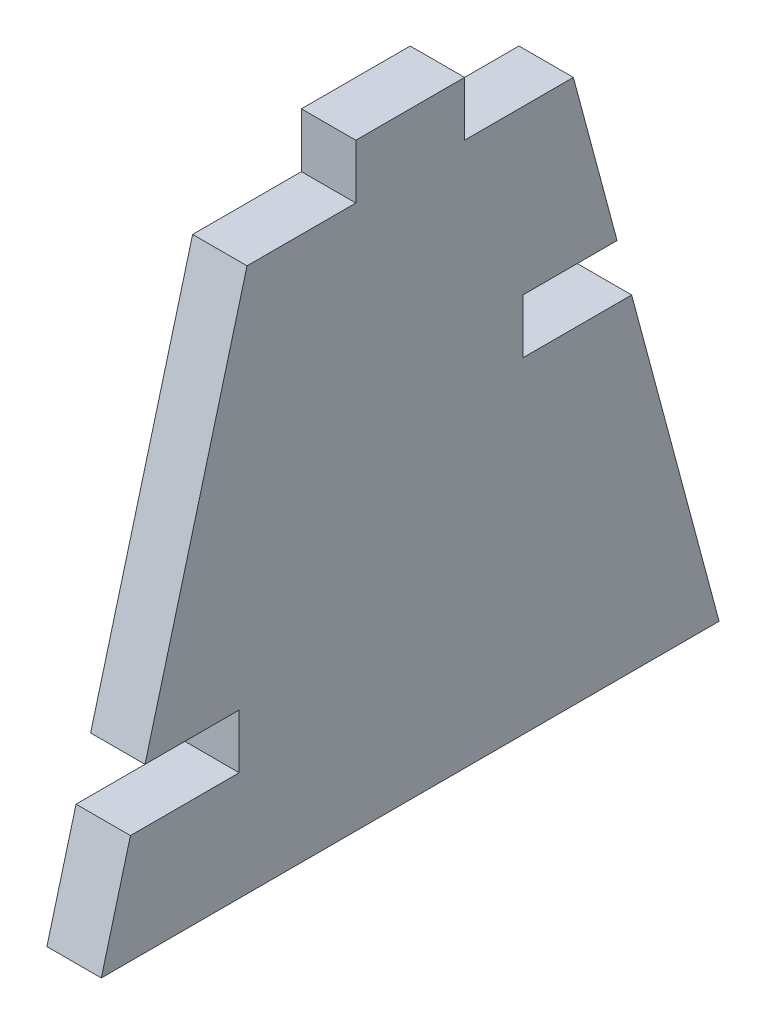
ISO-10303-21;
HEADER;
FILE_DESCRIPTION(('STEP AP214'),'2;1');
FILE_NAME('part.step','',(''),(''),'','','');
FILE_SCHEMA(('AUTOMOTIVE_DESIGN { 1 0 10303 214 1 1 1 1 }'));
ENDSEC;
DATA;
#1=APPLICATION_CONTEXT('core data for automotive mechanical design processes');
#2=APPLICATION_PROTOCOL_DEFINITION('international standard','automotive_design',2000,#1);
#3=PRODUCT_CONTEXT('',#1,'mechanical');
#4=PRODUCT('Part','Part','',(#3));
#5=PRODUCT_RELATED_PRODUCT_CATEGORY('part','',(#4));
#6=PRODUCT_DEFINITION_FORMATION('','',#4);
#7=PRODUCT_DEFINITION_CONTEXT('part definition',#1,'design');
#8=PRODUCT_DEFINITION('design','',#6,#7);
#9=PRODUCT_DEFINITION_SHAPE('','',#8);
#10=(LENGTH_UNIT() NAMED_UNIT(*) SI_UNIT(.MILLI.,.METRE.));
#11=(NAMED_UNIT(*) PLANE_ANGLE_UNIT() SI_UNIT($,.RADIAN.));
#12=(NAMED_UNIT(*) SI_UNIT($,.STERADIAN.) SOLID_ANGLE_UNIT());
#13=UNCERTAINTY_MEASURE_WITH_UNIT(LENGTH_MEASURE(1.E-05),#10,'distance_accuracy_value','');
#14=(GEOMETRIC_REPRESENTATION_CONTEXT(3) GLOBAL_UNCERTAINTY_ASSIGNED_CONTEXT((#13)) GLOBAL_UNIT_ASSIGNED_CONTEXT((#10,
#11,#12)) REPRESENTATION_CONTEXT('',''));
#15=CARTESIAN_POINT('',(0.,0.,0.));
#16=DIRECTION('',(0.,0.,1.));
#17=DIRECTION('',(1.,0.,0.));
#18=AXIS2_PLACEMENT_3D('',#15,#16,#17);
#19=CARTESIAN_POINT('',(-10.,100.,-26.7949192431127));
#20=DIRECTION('',(0.,-1.,0.));
#21=DIRECTION('',(0.,0.,-1.));
#22=AXIS2_PLACEMENT_3D('',#19,#20,#21);
#23=PLANE('',#22);
#24=DIRECTION('',(0.,0.,-1.));
#25=VECTOR('',#24,1.);
#26=CARTESIAN_POINT('',(0.,100.,-26.7949192431127));
#27=LINE('',#26,#25);
#28=CARTESIAN_POINT('',(0.,100.,-26.7949192431127));
#29=VERTEX_POINT('',#28);
#30=CARTESIAN_POINT('',(0.,100.,-46.7949192431127));
#31=VERTEX_POINT('',#30);
#32=EDGE_CURVE('E177',#29,#31,#27,.T.);
#33=ORIENTED_EDGE('',*,*,#32,.T.);
#34=DIRECTION('',(1.,0.,0.));
#35=VECTOR('',#34,1.);
#36=CARTESIAN_POINT('',(-10.,100.,-46.7949192431127));
#37=LINE('',#36,#35);
#38=CARTESIAN_POINT('',(-10.,100.,-46.7949192431127));
#39=VERTEX_POINT('',#38);
#40=EDGE_CURVE('E11',#39,#31,#37,.T.);
#41=ORIENTED_EDGE('',*,*,#40,.F.);
#42=DIRECTION('',(0.,0.,-1.));
#43=VECTOR('',#42,1.);
#44=CARTESIAN_POINT('',(-10.,100.,-26.7949192431127));
#45=LINE('',#44,#43);
#46=CARTESIAN_POINT('',(-10.,100.,-26.7949192431127));
#47=VERTEX_POINT('',#46);
#48=EDGE_CURVE('E111',#47,#39,#45,.T.);
#49=ORIENTED_EDGE('',*,*,#48,.F.);
#50=DIRECTION('',(1.,0.,0.));
#51=VECTOR('',#50,1.);
#52=CARTESIAN_POINT('',(-10.,100.,-26.7949192431127));
#53=LINE('',#52,#51);
#54=EDGE_CURVE('E49',#47,#29,#53,.T.);
#55=ORIENTED_EDGE('',*,*,#54,.T.);
#56=EDGE_LOOP('',(#33,#41,#49,#55));
#57=FACE_BOUND('',#56,.T.);
#58=ADVANCED_FACE('F33',(#57),#23,.F.);
#59=CARTESIAN_POINT('',(-10.,110.,-46.7949192431127));
#60=DIRECTION('',(0.,0.,1.));
#61=DIRECTION('',(1.,0.,0.));
#62=AXIS2_PLACEMENT_3D('',#59,#60,#61);
#63=PLANE('',#62);
#64=DIRECTION('',(0.,-1.,0.));
#65=VECTOR('',#64,1.);
#66=CARTESIAN_POINT('',(0.,110.,-46.7949192431127));
#67=LINE('',#66,#65);
#68=CARTESIAN_POINT('',(0.,110.,-46.7949192431127));
#69=VERTEX_POINT('',#68);
#70=EDGE_CURVE('E179',#69,#31,#67,.T.);
#71=ORIENTED_EDGE('',*,*,#70,.F.);
#72=DIRECTION('',(1.,0.,0.));
#73=VECTOR('',#72,1.);
#74=CARTESIAN_POINT('',(-10.,110.,-46.7949192431127));
#75=LINE('',#74,#73);
#76=CARTESIAN_POINT('',(-10.,110.,-46.7949192431127));
#77=VERTEX_POINT('',#76);
#78=EDGE_CURVE('E41',#77,#69,#75,.T.);
#79=ORIENTED_EDGE('',*,*,#78,.F.);
#80=DIRECTION('',(0.,-1.,0.));
#81=VECTOR('',#80,1.);
#82=CARTESIAN_POINT('',(-10.,110.,-46.7949192431127));
#83=LINE('',#82,#81);
#84=EDGE_CURVE('E463',#77,#39,#83,.T.);
#85=ORIENTED_EDGE('',*,*,#84,.T.);
#86=ORIENTED_EDGE('',*,*,#40,.T.);
#87=EDGE_LOOP('',(#71,#79,#85,#86));
#88=FACE_BOUND('',#87,.T.);
#89=ADVANCED_FACE('F251',(#88),#63,.T.);
#90=CARTESIAN_POINT('',(-10.,110.,-66.7949192431127));
#91=DIRECTION('',(0.,1.,0.));
#92=DIRECTION('',(0.,0.,1.));
#93=AXIS2_PLACEMENT_3D('',#90,#91,#92);
#94=PLANE('',#93);
#95=DIRECTION('',(0.,0.,1.));
#96=VECTOR('',#95,1.);
#97=CARTESIAN_POINT('',(0.,110.,-66.7949192431127));
#98=LINE('',#97,#96);
#99=CARTESIAN_POINT('',(0.,110.,-66.7949192431127));
#100=VERTEX_POINT('',#99);
#101=EDGE_CURVE('E182',#100,#69,#98,.T.);
#102=ORIENTED_EDGE('',*,*,#101,.F.);
#103=DIRECTION('',(1.,0.,0.));
#104=VECTOR('',#103,1.);
#105=CARTESIAN_POINT('',(-10.,110.,-66.7949192431127));
#106=LINE('',#105,#104);
#107=CARTESIAN_POINT('',(-10.,110.,-66.7949192431127));
#108=VERTEX_POINT('',#107);
#109=EDGE_CURVE('E241',#108,#100,#106,.T.);
#110=ORIENTED_EDGE('',*,*,#109,.F.);
#111=DIRECTION('',(0.,0.,1.));
#112=VECTOR('',#111,1.);
#113=CARTESIAN_POINT('',(-10.,110.,-66.7949192431127));
#114=LINE('',#113,#112);
#115=EDGE_CURVE('E248',#108,#77,#114,.T.);
#116=ORIENTED_EDGE('',*,*,#115,.T.);
#117=ORIENTED_EDGE('',*,*,#78,.T.);
#118=EDGE_LOOP('',(#102,#110,#116,#117));
#119=FACE_BOUND('',#118,.T.);
#120=ADVANCED_FACE('F246',(#119),#94,.T.);
#121=CARTESIAN_POINT('',(-10.,110.,-66.7949192431127));
#122=DIRECTION('',(0.,0.,1.));
#123=DIRECTION('',(1.,0.,0.));
#124=AXIS2_PLACEMENT_3D('',#121,#122,#123);
#125=PLANE('',#124);
#126=DIRECTION('',(0.,-1.,0.));
#127=VECTOR('',#126,1.);
#128=CARTESIAN_POINT('',(0.,110.,-66.7949192431127));
#129=LINE('',#128,#127);
#130=CARTESIAN_POINT('',(0.,100.,-66.7949192431127));
#131=VERTEX_POINT('',#130);
#132=EDGE_CURVE('E185',#100,#131,#129,.T.);
#133=ORIENTED_EDGE('',*,*,#132,.T.);
#134=DIRECTION('',(1.,0.,0.));
#135=VECTOR('',#134,1.);
#136=CARTESIAN_POINT('',(-10.,100.,-66.7949192431127));
#137=LINE('',#136,#135);
#138=CARTESIAN_POINT('',(-10.,100.,-66.7949192431127));
#139=VERTEX_POINT('',#138);
#140=EDGE_CURVE('E238',#139,#131,#137,.T.);
#141=ORIENTED_EDGE('',*,*,#140,.F.);
#142=DIRECTION('',(0.,-1.,0.));
#143=VECTOR('',#142,1.);
#144=CARTESIAN_POINT('',(-10.,110.,-66.7949192431127));
#145=LINE('',#144,#143);
#146=EDGE_CURVE('E268',#108,#139,#145,.T.);
#147=ORIENTED_EDGE('',*,*,#146,.F.);
#148=ORIENTED_EDGE('',*,*,#109,.T.);
#149=EDGE_LOOP('',(#133,#141,#147,#148));
#150=FACE_BOUND('',#149,.T.);
#151=ADVANCED_FACE('F259',(#150),#125,.F.);
#152=CARTESIAN_POINT('',(-10.,100.,-66.7949192431127));
#153=DIRECTION('',(0.,-1.,0.));
#154=DIRECTION('',(0.,0.,-1.));
#155=AXIS2_PLACEMENT_3D('',#152,#153,#154);
#156=PLANE('',#155);
#157=DIRECTION('',(0.,0.,-1.));
#158=VECTOR('',#157,1.);
#159=CARTESIAN_POINT('',(0.,100.,-66.7949192431127));
#160=LINE('',#159,#158);
#161=CARTESIAN_POINT('',(0.,100.,-86.7949192431127));
#162=VERTEX_POINT('',#161);
#163=EDGE_CURVE('E187',#131,#162,#160,.T.);
#164=ORIENTED_EDGE('',*,*,#163,.T.);
#165=DIRECTION('',(1.,0.,0.));
#166=VECTOR('',#165,1.);
#167=CARTESIAN_POINT('',(-10.,100.,-86.7949192431127));
#168=LINE('',#167,#166);
#169=CARTESIAN_POINT('',(-10.,100.,-86.7949192431127));
#170=VERTEX_POINT('',#169);
#171=EDGE_CURVE('E235',#170,#162,#168,.T.);
#172=ORIENTED_EDGE('',*,*,#171,.F.);
#173=DIRECTION('',(0.,0.,-1.));
#174=VECTOR('',#173,1.);
#175=CARTESIAN_POINT('',(-10.,100.,-66.7949192431127));
#176=LINE('',#175,#174);
#177=EDGE_CURVE('E265',#139,#170,#176,.T.);
#178=ORIENTED_EDGE('',*,*,#177,.F.);
#179=ORIENTED_EDGE('',*,*,#140,.T.);
#180=EDGE_LOOP('',(#164,#172,#178,#179));
#181=FACE_BOUND('',#180,.T.);
#182=ADVANCED_FACE('F263',(#181),#156,.F.);
#183=CARTESIAN_POINT('',(-10.,100.,-86.7949192431127));
#184=DIRECTION('',(0.,-0.258819045102523,0.965925826289068));
#185=DIRECTION('',(0.,-0.965925826289068,-0.258819045102523));
#186=AXIS2_PLACEMENT_3D('',#183,#184,#185);
#187=PLANE('',#186);
#188=DIRECTION('',(0.,-0.965925826289068,-0.258819045102523));
#189=VECTOR('',#188,1.);
#190=CARTESIAN_POINT('',(0.,100.,-86.7949192431127));
#191=LINE('',#190,#189);
#192=CARTESIAN_POINT('',(0.,70.,-94.8333950160465));
#193=VERTEX_POINT('',#192);
#194=EDGE_CURVE('E189',#162,#193,#191,.T.);
#195=ORIENTED_EDGE('',*,*,#194,.T.);
#196=DIRECTION('',(1.,0.,0.));
#197=VECTOR('',#196,1.);
#198=CARTESIAN_POINT('',(-10.,70.,-94.8333950160465));
#199=LINE('',#198,#197);
#200=CARTESIAN_POINT('',(-10.,70.,-94.8333950160465));
#201=VERTEX_POINT('',#200);
#202=EDGE_CURVE('E233',#201,#193,#199,.T.);
#203=ORIENTED_EDGE('',*,*,#202,.F.);
#204=DIRECTION('',(0.,-0.965925826289068,-0.258819045102523));
#205=VECTOR('',#204,1.);
#206=CARTESIAN_POINT('',(-10.,100.,-86.7949192431127));
#207=LINE('',#206,#205);
#208=EDGE_CURVE('E267',#170,#201,#207,.T.);
#209=ORIENTED_EDGE('',*,*,#208,.F.);
#210=ORIENTED_EDGE('',*,*,#171,.T.);
#211=EDGE_LOOP('',(#195,#203,#209,#210));
#212=FACE_BOUND('',#211,.T.);
#213=ADVANCED_FACE('F407',(#212),#187,.F.);
#214=CARTESIAN_POINT('',(-10.,70.,-77.5128869403577));
#215=DIRECTION('',(0.,-1.,0.));
#216=DIRECTION('',(0.,0.,-1.));
#217=AXIS2_PLACEMENT_3D('',#214,#215,#216);
#218=PLANE('',#217);
#219=DIRECTION('',(0.,0.,-1.));
#220=VECTOR('',#219,1.);
#221=CARTESIAN_POINT('',(0.,70.,-77.5128869403577));
#222=LINE('',#221,#220);
#223=CARTESIAN_POINT('',(0.,70.,-77.5128869403577));
#224=VERTEX_POINT('',#223);
#225=EDGE_CURVE('E192',#224,#193,#222,.T.);
#226=ORIENTED_EDGE('',*,*,#225,.F.);
#227=DIRECTION('',(1.,0.,0.));
#228=VECTOR('',#227,1.);
#229=CARTESIAN_POINT('',(-10.,70.,-77.5128869403577));
#230=LINE('',#229,#228);
#231=CARTESIAN_POINT('',(-10.,70.,-77.5128869403577));
#232=VERTEX_POINT('',#231);
#233=EDGE_CURVE('E231',#232,#224,#230,.T.);
#234=ORIENTED_EDGE('',*,*,#233,.F.);
#235=DIRECTION('',(0.,0.,-1.));
#236=VECTOR('',#235,1.);
#237=CARTESIAN_POINT('',(-10.,70.,-77.5128869403577));
#238=LINE('',#237,#236);
#239=EDGE_CURVE('E270',#232,#201,#238,.T.);
#240=ORIENTED_EDGE('',*,*,#239,.T.);
#241=ORIENTED_EDGE('',*,*,#202,.T.);
#242=EDGE_LOOP('',(#226,#234,#240,#241));
#243=FACE_BOUND('',#242,.T.);
#244=ADVANCED_FACE('F397',(#243),#218,.T.);
#245=CARTESIAN_POINT('',(-10.,60.,-77.5128869403577));
#246=DIRECTION('',(0.,0.,-1.));
#247=DIRECTION('',(-1.,0.,0.));
#248=AXIS2_PLACEMENT_3D('',#245,#246,#247);
#249=PLANE('',#248);
#250=DIRECTION('',(0.,1.,0.));
#251=VECTOR('',#250,1.);
#252=CARTESIAN_POINT('',(0.,60.,-77.5128869403577));
#253=LINE('',#252,#251);
#254=CARTESIAN_POINT('',(0.,60.,-77.5128869403577));
#255=VERTEX_POINT('',#254);
#256=EDGE_CURVE('E195',#255,#224,#253,.T.);
#257=ORIENTED_EDGE('',*,*,#256,.F.);
#258=DIRECTION('',(1.,0.,0.));
#259=VECTOR('',#258,1.);
#260=CARTESIAN_POINT('',(-10.,60.,-77.5128869403577));
#261=LINE('',#260,#259);
#262=CARTESIAN_POINT('',(-10.,60.,-77.5128869403577));
#263=VERTEX_POINT('',#262);
#264=EDGE_CURVE('E229',#263,#255,#261,.T.);
#265=ORIENTED_EDGE('',*,*,#264,.F.);
#266=DIRECTION('',(0.,1.,0.));
#267=VECTOR('',#266,1.);
#268=CARTESIAN_POINT('',(-10.,60.,-77.5128869403577));
#269=LINE('',#268,#267);
#270=EDGE_CURVE('E277',#263,#232,#269,.T.);
#271=ORIENTED_EDGE('',*,*,#270,.T.);
#272=ORIENTED_EDGE('',*,*,#233,.T.);
#273=EDGE_LOOP('',(#257,#265,#271,#272));
#274=FACE_BOUND('',#273,.T.);
#275=ADVANCED_FACE('F387',(#274),#249,.T.);
#276=CARTESIAN_POINT('',(-10.,60.,-97.5128869403577));
#277=DIRECTION('',(0.,1.,0.));
#278=DIRECTION('',(0.,0.,1.));
#279=AXIS2_PLACEMENT_3D('',#276,#277,#278);
#280=PLANE('',#279);
#281=DIRECTION('',(0.,0.,1.));
#282=VECTOR('',#281,1.);
#283=CARTESIAN_POINT('',(0.,60.,-97.5128869403577));
#284=LINE('',#283,#282);
#285=CARTESIAN_POINT('',(0.,60.,-97.5128869403577));
#286=VERTEX_POINT('',#285);
#287=EDGE_CURVE('E198',#286,#255,#284,.T.);
#288=ORIENTED_EDGE('',*,*,#287,.F.);
#289=DIRECTION('',(1.,0.,0.));
#290=VECTOR('',#289,1.);
#291=CARTESIAN_POINT('',(-10.,60.,-97.5128869403577));
#292=LINE('',#291,#290);
#293=CARTESIAN_POINT('',(-10.,60.,-97.5128869403577));
#294=VERTEX_POINT('',#293);
#295=EDGE_CURVE('E227',#294,#286,#292,.T.);
#296=ORIENTED_EDGE('',*,*,#295,.F.);
#297=DIRECTION('',(0.,0.,1.));
#298=VECTOR('',#297,1.);
#299=CARTESIAN_POINT('',(-10.,60.,-97.5128869403577));
#300=LINE('',#299,#298);
#301=EDGE_CURVE('E280',#294,#263,#300,.T.);
#302=ORIENTED_EDGE('',*,*,#301,.T.);
#303=ORIENTED_EDGE('',*,*,#264,.T.);
#304=EDGE_LOOP('',(#288,#296,#302,#303));
#305=FACE_BOUND('',#304,.T.);
#306=ADVANCED_FACE('F377',(#305),#280,.T.);
#307=CARTESIAN_POINT('',(-10.,60.,-97.5128869403577));
#308=DIRECTION('',(0.,-0.258819045102523,0.965925826289068));
#309=DIRECTION('',(0.,-0.965925826289068,-0.258819045102523));
#310=AXIS2_PLACEMENT_3D('',#307,#308,#309);
#311=PLANE('',#310);
#312=DIRECTION('',(0.,-0.965925826289068,-0.258819045102523));
#313=VECTOR('',#312,1.);
#314=CARTESIAN_POINT('',(0.,60.,-97.5128869403577));
#315=LINE('',#314,#313);
#316=CARTESIAN_POINT('',(0.,0.,-113.589838486225));
#317=VERTEX_POINT('',#316);
#318=EDGE_CURVE('E201',#286,#317,#315,.T.);
#319=ORIENTED_EDGE('',*,*,#318,.T.);
#320=DIRECTION('',(1.,0.,0.));
#321=VECTOR('',#320,1.);
#322=CARTESIAN_POINT('',(-10.,0.,-113.589838486225));
#323=LINE('',#322,#321);
#324=CARTESIAN_POINT('',(-10.,0.,-113.589838486225));
#325=VERTEX_POINT('',#324);
#326=EDGE_CURVE('E225',#325,#317,#323,.T.);
#327=ORIENTED_EDGE('',*,*,#326,.F.);
#328=DIRECTION('',(0.,-0.965925826289068,-0.258819045102523));
#329=VECTOR('',#328,1.);
#330=CARTESIAN_POINT('',(-10.,60.,-97.5128869403577));
#331=LINE('',#330,#329);
#332=EDGE_CURVE('E283',#294,#325,#331,.T.);
#333=ORIENTED_EDGE('',*,*,#332,.F.);
#334=ORIENTED_EDGE('',*,*,#295,.T.);
#335=EDGE_LOOP('',(#319,#327,#333,#334));
#336=FACE_BOUND('',#335,.T.);
#337=ADVANCED_FACE('F368',(#336),#311,.F.);
#338=CARTESIAN_POINT('',(-10.,0.,0.));
#339=DIRECTION('',(0.,-1.,0.));
#340=DIRECTION('',(0.,0.,-1.));
#341=AXIS2_PLACEMENT_3D('',#338,#339,#340);
#342=PLANE('',#341);
#343=DIRECTION('',(0.,0.,-1.));
#344=VECTOR('',#343,1.);
#345=CARTESIAN_POINT('',(0.,0.,0.));
#346=LINE('',#345,#344);
#347=CARTESIAN_POINT('',(0.,0.,0.));
#348=VERTEX_POINT('',#347);
#349=EDGE_CURVE('E204',#348,#317,#346,.T.);
#350=ORIENTED_EDGE('',*,*,#349,.F.);
#351=DIRECTION('',(1.,0.,0.));
#352=VECTOR('',#351,1.);
#353=CARTESIAN_POINT('',(-10.,0.,0.));
#354=LINE('',#353,#352);
#355=CARTESIAN_POINT('',(-10.,0.,0.));
#356=VERTEX_POINT('',#355);
#357=EDGE_CURVE('E223',#356,#348,#354,.T.);
#358=ORIENTED_EDGE('',*,*,#357,.F.);
#359=DIRECTION('',(0.,0.,-1.));
#360=VECTOR('',#359,1.);
#361=CARTESIAN_POINT('',(-10.,0.,0.));
#362=LINE('',#361,#360);
#363=EDGE_CURVE('E285',#356,#325,#362,.T.);
#364=ORIENTED_EDGE('',*,*,#363,.T.);
#365=ORIENTED_EDGE('',*,*,#326,.T.);
#366=EDGE_LOOP('',(#350,#358,#364,#365));
#367=FACE_BOUND('',#366,.T.);
#368=ADVANCED_FACE('F299',(#367),#342,.T.);
#369=CARTESIAN_POINT('',(-10.,20.,-5.35898384862254));
#370=DIRECTION('',(0.,0.258819045102525,0.965925826289067));
#371=DIRECTION('',(0.,-0.965925826289067,0.258819045102525));
#372=AXIS2_PLACEMENT_3D('',#369,#370,#371);
#373=PLANE('',#372);
#374=DIRECTION('',(0.,-0.965925826289067,0.258819045102525));
#375=VECTOR('',#374,1.);
#376=CARTESIAN_POINT('',(0.,20.,-5.35898384862254));
#377=LINE('',#376,#375);
#378=CARTESIAN_POINT('',(0.,20.,-5.35898384862254));
#379=VERTEX_POINT('',#378);
#380=EDGE_CURVE('E207',#379,#348,#377,.T.);
#381=ORIENTED_EDGE('',*,*,#380,.F.);
#382=DIRECTION('',(1.,0.,0.));
#383=VECTOR('',#382,1.);
#384=CARTESIAN_POINT('',(-10.,20.,-5.35898384862254));
#385=LINE('',#384,#383);
#386=CARTESIAN_POINT('',(-10.,20.,-5.35898384862254));
#387=VERTEX_POINT('',#386);
#388=EDGE_CURVE('E221',#387,#379,#385,.T.);
#389=ORIENTED_EDGE('',*,*,#388,.F.);
#390=DIRECTION('',(0.,-0.965925826289067,0.258819045102525));
#391=VECTOR('',#390,1.);
#392=CARTESIAN_POINT('',(-10.,20.,-5.35898384862254));
#393=LINE('',#392,#391);
#394=EDGE_CURVE('E288',#387,#356,#393,.T.);
#395=ORIENTED_EDGE('',*,*,#394,.T.);
#396=ORIENTED_EDGE('',*,*,#357,.T.);
#397=EDGE_LOOP('',(#381,#389,#395,#396));
#398=FACE_BOUND('',#397,.T.);
#399=ADVANCED_FACE('F292',(#398),#373,.T.);
#400=CARTESIAN_POINT('',(-10.,20.,-5.35898384862254));
#401=DIRECTION('',(0.,-1.,0.));
#402=DIRECTION('',(0.,0.,-1.));
#403=AXIS2_PLACEMENT_3D('',#400,#401,#402);
#404=PLANE('',#403);
#405=DIRECTION('',(0.,0.,-1.));
#406=VECTOR('',#405,1.);
#407=CARTESIAN_POINT('',(0.,20.,-5.35898384862254));
#408=LINE('',#407,#406);
#409=CARTESIAN_POINT('',(0.,20.,-25.3589838486225));
#410=VERTEX_POINT('',#409);
#411=EDGE_CURVE('E210',#379,#410,#408,.T.);
#412=ORIENTED_EDGE('',*,*,#411,.T.);
#413=DIRECTION('',(1.,0.,0.));
#414=VECTOR('',#413,1.);
#415=CARTESIAN_POINT('',(-10.,20.,-25.3589838486225));
#416=LINE('',#415,#414);
#417=CARTESIAN_POINT('',(-10.,20.,-25.3589838486225));
#418=VERTEX_POINT('',#417);
#419=EDGE_CURVE('E169',#418,#410,#416,.T.);
#420=ORIENTED_EDGE('',*,*,#419,.F.);
#421=DIRECTION('',(0.,0.,-1.));
#422=VECTOR('',#421,1.);
#423=CARTESIAN_POINT('',(-10.,20.,-5.35898384862254));
#424=LINE('',#423,#422);
#425=EDGE_CURVE('E157',#387,#418,#424,.T.);
#426=ORIENTED_EDGE('',*,*,#425,.F.);
#427=ORIENTED_EDGE('',*,*,#388,.T.);
#428=EDGE_LOOP('',(#412,#420,#426,#427));
#429=FACE_BOUND('',#428,.T.);
#430=ADVANCED_FACE('F303',(#429),#404,.F.);
#431=CARTESIAN_POINT('',(-10.,20.,-25.3589838486225));
#432=DIRECTION('',(0.,0.,-1.));
#433=DIRECTION('',(-1.,0.,0.));
#434=AXIS2_PLACEMENT_3D('',#431,#432,#433);
#435=PLANE('',#434);
#436=DIRECTION('',(0.,1.,0.));
#437=VECTOR('',#436,1.);
#438=CARTESIAN_POINT('',(0.,20.,-25.3589838486225));
#439=LINE('',#438,#437);
#440=CARTESIAN_POINT('',(0.,30.,-25.3589838486225));
#441=VERTEX_POINT('',#440);
#442=EDGE_CURVE('E166',#410,#441,#439,.T.);
#443=ORIENTED_EDGE('',*,*,#442,.T.);
#444=DIRECTION('',(1.,0.,0.));
#445=VECTOR('',#444,1.);
#446=CARTESIAN_POINT('',(-10.,30.,-25.3589838486225));
#447=LINE('',#446,#445);
#448=CARTESIAN_POINT('',(-10.,30.,-25.3589838486225));
#449=VERTEX_POINT('',#448);
#450=EDGE_CURVE('E163',#449,#441,#447,.T.);
#451=ORIENTED_EDGE('',*,*,#450,.F.);
#452=DIRECTION('',(0.,1.,0.));
#453=VECTOR('',#452,1.);
#454=CARTESIAN_POINT('',(-10.,20.,-25.3589838486225));
#455=LINE('',#454,#453);
#456=EDGE_CURVE('E150',#418,#449,#455,.T.);
#457=ORIENTED_EDGE('',*,*,#456,.F.);
#458=ORIENTED_EDGE('',*,*,#419,.T.);
#459=EDGE_LOOP('',(#443,#451,#457,#458));
#460=FACE_BOUND('',#459,.T.);
#461=ADVANCED_FACE('F164',(#460),#435,.F.);
#462=CARTESIAN_POINT('',(-10.,30.,-25.3589838486225));
#463=DIRECTION('',(0.,1.,0.));
#464=DIRECTION('',(0.,0.,1.));
#465=AXIS2_PLACEMENT_3D('',#462,#463,#464);
#466=PLANE('',#465);
#467=DIRECTION('',(0.,0.,1.));
#468=VECTOR('',#467,1.);
#469=CARTESIAN_POINT('',(0.,30.,-25.3589838486225));
#470=LINE('',#469,#468);
#471=CARTESIAN_POINT('',(0.,30.,-8.03847577293381));
#472=VERTEX_POINT('',#471);
#473=EDGE_CURVE('E213',#441,#472,#470,.T.);
#474=ORIENTED_EDGE('',*,*,#473,.T.);
#475=DIRECTION('',(1.,0.,0.));
#476=VECTOR('',#475,1.);
#477=CARTESIAN_POINT('',(-10.,30.,-8.03847577293381));
#478=LINE('',#477,#476);
#479=CARTESIAN_POINT('',(-10.,30.,-8.03847577293381));
#480=VERTEX_POINT('',#479);
#481=EDGE_CURVE('E99',#480,#472,#478,.T.);
#482=ORIENTED_EDGE('',*,*,#481,.F.);
#483=DIRECTION('',(0.,0.,1.));
#484=VECTOR('',#483,1.);
#485=CARTESIAN_POINT('',(-10.,30.,-25.3589838486225));
#486=LINE('',#485,#484);
#487=EDGE_CURVE('E154',#449,#480,#486,.T.);
#488=ORIENTED_EDGE('',*,*,#487,.F.);
#489=ORIENTED_EDGE('',*,*,#450,.T.);
#490=EDGE_LOOP('',(#474,#482,#488,#489));
#491=FACE_BOUND('',#490,.T.);
#492=ADVANCED_FACE('F171',(#491),#466,.F.);
#493=CARTESIAN_POINT('',(-10.,100.,-26.7949192431127));
#494=DIRECTION('',(0.,0.258819045102525,0.965925826289067));
#495=DIRECTION('',(0.,-0.965925826289067,0.258819045102525));
#496=AXIS2_PLACEMENT_3D('',#493,#494,#495);
#497=PLANE('',#496);
#498=DIRECTION('',(0.,-0.965925826289067,0.258819045102525));
#499=VECTOR('',#498,1.);
#500=CARTESIAN_POINT('',(0.,100.,-26.7949192431127));
#501=LINE('',#500,#499);
#502=EDGE_CURVE('E215',#29,#472,#501,.T.);
#503=ORIENTED_EDGE('',*,*,#502,.F.);
#504=ORIENTED_EDGE('',*,*,#54,.F.);
#505=DIRECTION('',(0.,-0.965925826289067,0.258819045102525));
#506=VECTOR('',#505,1.);
#507=CARTESIAN_POINT('',(-10.,100.,-26.7949192431127));
#508=LINE('',#507,#506);
#509=EDGE_CURVE('E172',#47,#480,#508,.T.);
#510=ORIENTED_EDGE('',*,*,#509,.T.);
#511=ORIENTED_EDGE('',*,*,#481,.T.);
#512=EDGE_LOOP('',(#503,#504,#510,#511));
#513=FACE_BOUND('',#512,.T.);
#514=ADVANCED_FACE('F316',(#513),#497,.T.);
#515=CARTESIAN_POINT('',(-10.,0.,0.));
#516=DIRECTION('',(-1.,0.,0.));
#517=DIRECTION('',(0.,0.,1.));
#518=AXIS2_PLACEMENT_3D('',#515,#516,#517);
#519=PLANE('',#518);
#520=ORIENTED_EDGE('',*,*,#48,.T.);
#521=ORIENTED_EDGE('',*,*,#84,.F.);
#522=ORIENTED_EDGE('',*,*,#115,.F.);
#523=ORIENTED_EDGE('',*,*,#146,.T.);
#524=ORIENTED_EDGE('',*,*,#177,.T.);
#525=ORIENTED_EDGE('',*,*,#208,.T.);
#526=ORIENTED_EDGE('',*,*,#239,.F.);
#527=ORIENTED_EDGE('',*,*,#270,.F.);
#528=ORIENTED_EDGE('',*,*,#301,.F.);
#529=ORIENTED_EDGE('',*,*,#332,.T.);
#530=ORIENTED_EDGE('',*,*,#363,.F.);
#531=ORIENTED_EDGE('',*,*,#394,.F.);
#532=ORIENTED_EDGE('',*,*,#425,.T.);
#533=ORIENTED_EDGE('',*,*,#456,.T.);
#534=ORIENTED_EDGE('',*,*,#487,.T.);
#535=ORIENTED_EDGE('',*,*,#509,.F.);
#536=EDGE_LOOP('',(#520,#521,#522,#523,#524,#525,#526,#527,#528,#529,#530,#531,#532,#533,#534,#535));
#537=FACE_BOUND('',#536,.T.);
#538=ADVANCED_FACE('F152',(#537),#519,.T.);
#539=CARTESIAN_POINT('',(0.,0.,0.));
#540=DIRECTION('',(-1.,0.,0.));
#541=DIRECTION('',(0.,0.,1.));
#542=AXIS2_PLACEMENT_3D('',#539,#540,#541);
#543=PLANE('',#542);
#544=ORIENTED_EDGE('',*,*,#32,.F.);
#545=ORIENTED_EDGE('',*,*,#502,.T.);
#546=ORIENTED_EDGE('',*,*,#473,.F.);
#547=ORIENTED_EDGE('',*,*,#442,.F.);
#548=ORIENTED_EDGE('',*,*,#411,.F.);
#549=ORIENTED_EDGE('',*,*,#380,.T.);
#550=ORIENTED_EDGE('',*,*,#349,.T.);
#551=ORIENTED_EDGE('',*,*,#318,.F.);
#552=ORIENTED_EDGE('',*,*,#287,.T.);
#553=ORIENTED_EDGE('',*,*,#256,.T.);
#554=ORIENTED_EDGE('',*,*,#225,.T.);
#555=ORIENTED_EDGE('',*,*,#194,.F.);
#556=ORIENTED_EDGE('',*,*,#163,.F.);
#557=ORIENTED_EDGE('',*,*,#132,.F.);
#558=ORIENTED_EDGE('',*,*,#101,.T.);
#559=ORIENTED_EDGE('',*,*,#70,.T.);
#560=EDGE_LOOP('',(#544,#545,#546,#547,#548,#549,#550,#551,#552,#553,#554,#555,#556,#557,#558,#559));
#561=FACE_BOUND('',#560,.T.);
#562=ADVANCED_FACE('F254',(#561),#543,.F.);
#563=CLOSED_SHELL('',(#58,#89,#120,#151,#182,#213,#244,#275,#306,#337,#368,#399,#430,#461,#492,
#514,#538,#562));
#564=MANIFOLD_SOLID_BREP('B2',#563);
#565=ADVANCED_BREP_SHAPE_REPRESENTATION('',(#18,#564),#14);
#566=SHAPE_DEFINITION_REPRESENTATION(#9,#565);
ENDSEC;
END-ISO-10303-21;
